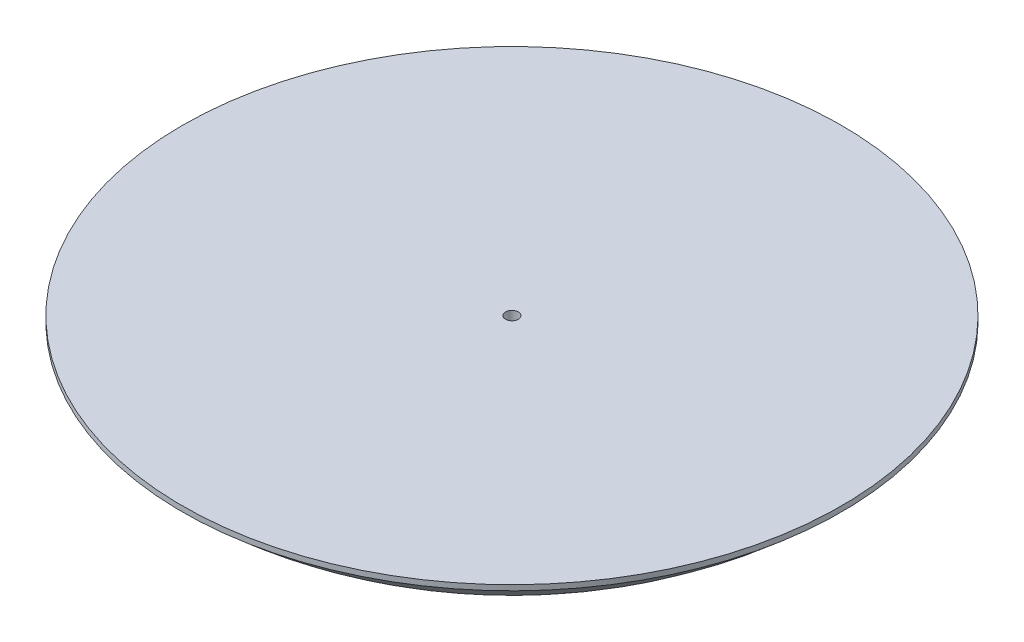
ISO-10303-21;
HEADER;
FILE_DESCRIPTION(('STEP AP214'),'2;1');
FILE_NAME('part.step','',(''),(''),'','','');
FILE_SCHEMA(('AUTOMOTIVE_DESIGN { 1 0 10303 214 1 1 1 1 }'));
ENDSEC;
DATA;
#1=APPLICATION_CONTEXT('core data for automotive mechanical design processes');
#2=APPLICATION_PROTOCOL_DEFINITION('international standard','automotive_design',2000,#1);
#3=PRODUCT_CONTEXT('',#1,'mechanical');
#4=PRODUCT('Part','Part','',(#3));
#5=PRODUCT_RELATED_PRODUCT_CATEGORY('part','',(#4));
#6=PRODUCT_DEFINITION_FORMATION('','',#4);
#7=PRODUCT_DEFINITION_CONTEXT('part definition',#1,'design');
#8=PRODUCT_DEFINITION('design','',#6,#7);
#9=PRODUCT_DEFINITION_SHAPE('','',#8);
#10=(LENGTH_UNIT() NAMED_UNIT(*) SI_UNIT(.MILLI.,.METRE.));
#11=(NAMED_UNIT(*) PLANE_ANGLE_UNIT() SI_UNIT($,.RADIAN.));
#12=(NAMED_UNIT(*) SI_UNIT($,.STERADIAN.) SOLID_ANGLE_UNIT());
#13=UNCERTAINTY_MEASURE_WITH_UNIT(LENGTH_MEASURE(1.E-05),#10,'distance_accuracy_value','');
#14=(GEOMETRIC_REPRESENTATION_CONTEXT(3) GLOBAL_UNCERTAINTY_ASSIGNED_CONTEXT((#13)) GLOBAL_UNIT_ASSIGNED_CONTEXT((#10,
#11,#12)) REPRESENTATION_CONTEXT('',''));
#15=CARTESIAN_POINT('',(0.,0.,0.));
#16=DIRECTION('',(0.,0.,1.));
#17=DIRECTION('',(1.,0.,0.));
#18=AXIS2_PLACEMENT_3D('',#15,#16,#17);
#19=CARTESIAN_POINT('',(-3.9441919782307E-11,-3.09840247534297E-12,0.));
#20=CARTESIAN_POINT('',(3.75000000458887,0.29476152606908,0.));
#21=CARTESIAN_POINT('',(7.4999999988391,5.04827134298948,0.));
#22=CARTESIAN_POINT('',(11.2500000017006,6.10210110981788,0.));
#23=CARTESIAN_POINT('',(14.9999999992605,9.43366962848143,0.));
#24=CARTESIAN_POINT('',(18.7499999992923,11.703227442977,0.));
#25=CARTESIAN_POINT('',(22.4999999993699,13.9531262219356,0.));
#26=CARTESIAN_POINT('',(26.2499999994982,16.1812211283658,0.));
#27=CARTESIAN_POINT('',(29.9999999998415,18.3169684070294,0.));
#28=B_SPLINE_CURVE_WITH_KNOTS('',8,(#19,#20,#21,#22,#23,#24,#25,#26,#27),.UNSPECIFIED.,.F.,.F.,
(9,9),(0.0791303829234686,0.916284581415392),.UNSPECIFIED.);
#29=CARTESIAN_POINT('',(0.,35.1595557269358,0.));
#30=DIRECTION('',(0.,1.,0.));
#31=AXIS1_PLACEMENT('',#29,#30);
#32=SURFACE_OF_REVOLUTION('',#28,#31);
#33=CARTESIAN_POINT('',(0.,0.267238646765137,0.));
#34=DIRECTION('',(0.,1.,0.));
#35=DIRECTION('',(-1.,0.,0.));
#36=AXIS2_PLACEMENT_3D('',#33,#34,#35);
#37=CIRCLE('',#36,1.2);
#38=CARTESIAN_POINT('',(-1.2,0.267238646765137,0.));
#39=VERTEX_POINT('',#38);
#40=EDGE_CURVE('E57',#39,#39,#37,.T.);
#41=ORIENTED_EDGE('',*,*,#40,.T.);
#42=EDGE_LOOP('',(#41));
#43=FACE_BOUND('',#42,.T.);
#44=CARTESIAN_POINT('',(0.,18.3169684071197,0.));
#45=DIRECTION('',(0.,1.,0.));
#46=DIRECTION('',(-1.,0.,0.));
#47=AXIS2_PLACEMENT_3D('',#44,#45,#46);
#48=CIRCLE('',#47,30.);
#49=CARTESIAN_POINT('',(-30.,18.3169684071197,0.));
#50=VERTEX_POINT('',#49);
#51=EDGE_CURVE('E54',#50,#50,#48,.T.);
#52=ORIENTED_EDGE('',*,*,#51,.F.);
#53=EDGE_LOOP('',(#52));
#54=FACE_BOUND('',#53,.T.);
#55=ADVANCED_FACE('F31',(#43,#54),#32,.T.);
#56=CARTESIAN_POINT('',(0.,35.1595557269358,0.));
#57=DIRECTION('',(0.,1.,0.));
#58=DIRECTION('',(-1.,0.,0.));
#59=AXIS2_PLACEMENT_3D('',#56,#57,#58);
#60=CYLINDRICAL_SURFACE('',#59,1.2);
#61=CARTESIAN_POINT('',(0.,35.1595557269358,0.));
#62=DIRECTION('',(0.,1.,0.));
#63=DIRECTION('',(-1.,0.,0.));
#64=AXIS2_PLACEMENT_3D('',#61,#62,#63);
#65=CIRCLE('',#64,1.2);
#66=CARTESIAN_POINT('',(-1.2,35.1595557269358,0.));
#67=VERTEX_POINT('',#66);
#68=EDGE_CURVE('E10',#67,#67,#65,.T.);
#69=ORIENTED_EDGE('',*,*,#68,.T.);
#70=EDGE_LOOP('',(#69));
#71=FACE_BOUND('',#70,.T.);
#72=ORIENTED_EDGE('',*,*,#40,.F.);
#73=EDGE_LOOP('',(#72));
#74=FACE_BOUND('',#73,.T.);
#75=ADVANCED_FACE('F82',(#71,#74),#60,.F.);
#76=CARTESIAN_POINT('',(1.2,35.1595557269358,0.));
#77=DIRECTION('',(0.,-1.,0.));
#78=DIRECTION('',(1.,0.,0.));
#79=AXIS2_PLACEMENT_3D('',#76,#77,#78);
#80=PLANE('',#79);
#81=ORIENTED_EDGE('',*,*,#68,.F.);
#82=EDGE_LOOP('',(#81));
#83=FACE_BOUND('',#82,.T.);
#84=CARTESIAN_POINT('',(0.,35.1595557269358,0.));
#85=DIRECTION('',(0.,1.,0.));
#86=DIRECTION('',(-1.,0.,0.));
#87=AXIS2_PLACEMENT_3D('',#84,#85,#86);
#88=CIRCLE('',#87,62.);
#89=CARTESIAN_POINT('',(-62.,35.1595557269358,0.));
#90=VERTEX_POINT('',#89);
#91=EDGE_CURVE('E38',#90,#90,#88,.T.);
#92=ORIENTED_EDGE('',*,*,#91,.T.);
#93=EDGE_LOOP('',(#92));
#94=FACE_BOUND('',#93,.T.);
#95=ADVANCED_FACE('F79',(#83,#94),#80,.F.);
#96=CARTESIAN_POINT('',(0.,35.1595557269358,0.));
#97=DIRECTION('',(0.,1.,0.));
#98=DIRECTION('',(-1.,0.,0.));
#99=AXIS2_PLACEMENT_3D('',#96,#97,#98);
#100=CYLINDRICAL_SURFACE('',#99,62.);
#101=ORIENTED_EDGE('',*,*,#91,.F.);
#102=EDGE_LOOP('',(#101));
#103=FACE_BOUND('',#102,.T.);
#104=CARTESIAN_POINT('',(0.,34.1595557269358,0.));
#105=DIRECTION('',(0.,1.,0.));
#106=DIRECTION('',(-1.,0.,0.));
#107=AXIS2_PLACEMENT_3D('',#104,#105,#106);
#108=CIRCLE('',#107,62.);
#109=CARTESIAN_POINT('',(-62.,34.1595557269358,0.));
#110=VERTEX_POINT('',#109);
#111=EDGE_CURVE('E42',#110,#110,#108,.T.);
#112=ORIENTED_EDGE('',*,*,#111,.T.);
#113=EDGE_LOOP('',(#112));
#114=FACE_BOUND('',#113,.T.);
#115=ADVANCED_FACE('F74',(#103,#114),#100,.T.);
#116=CARTESIAN_POINT('',(31.9999999999998,19.3169684071196,0.));
#117=CARTESIAN_POINT('',(46.9999999999956,20.4960144808466,0.));
#118=CARTESIAN_POINT('',(61.9999999999979,34.1595557269339,0.));
#119=B_SPLINE_CURVE_WITH_KNOTS('',2,(#116,#117,#118),.UNSPECIFIED.,.F.,.F.,(3,3),
(0.0845474704880553,0.930022175368585),.UNSPECIFIED.);
#120=CARTESIAN_POINT('',(0.,35.1595557269358,0.));
#121=DIRECTION('',(0.,1.,0.));
#122=AXIS1_PLACEMENT('',#120,#121);
#123=SURFACE_OF_REVOLUTION('',#119,#122);
#124=ORIENTED_EDGE('',*,*,#111,.F.);
#125=EDGE_LOOP('',(#124));
#126=FACE_BOUND('',#125,.T.);
#127=CARTESIAN_POINT('',(0.,19.3169684071196,0.));
#128=DIRECTION('',(0.,1.,0.));
#129=DIRECTION('',(-1.,0.,0.));
#130=AXIS2_PLACEMENT_3D('',#127,#128,#129);
#131=CIRCLE('',#130,31.9999999999998);
#132=CARTESIAN_POINT('',(-31.9999999999998,19.3169684071196,0.));
#133=VERTEX_POINT('',#132);
#134=EDGE_CURVE('E46',#133,#133,#131,.T.);
#135=ORIENTED_EDGE('',*,*,#134,.T.);
#136=EDGE_LOOP('',(#135));
#137=FACE_BOUND('',#136,.T.);
#138=ADVANCED_FACE('F69',(#126,#137),#123,.T.);
#139=CARTESIAN_POINT('',(30.,19.3169684071197,0.));
#140=DIRECTION('',(0.,1.,0.));
#141=DIRECTION('',(-1.,0.,0.));
#142=AXIS2_PLACEMENT_3D('',#139,#140,#141);
#143=PLANE('',#142);
#144=ORIENTED_EDGE('',*,*,#134,.F.);
#145=EDGE_LOOP('',(#144));
#146=FACE_BOUND('',#145,.T.);
#147=CARTESIAN_POINT('',(0.,19.3169684071197,0.));
#148=DIRECTION('',(0.,1.,0.));
#149=DIRECTION('',(-1.,0.,0.));
#150=AXIS2_PLACEMENT_3D('',#147,#148,#149);
#151=CIRCLE('',#150,30.);
#152=CARTESIAN_POINT('',(-30.,19.3169684071197,0.));
#153=VERTEX_POINT('',#152);
#154=EDGE_CURVE('E51',#153,#153,#151,.T.);
#155=ORIENTED_EDGE('',*,*,#154,.T.);
#156=EDGE_LOOP('',(#155));
#157=FACE_BOUND('',#156,.T.);
#158=ADVANCED_FACE('F73',(#146,#157),#143,.F.);
#159=CARTESIAN_POINT('',(0.,35.1595557269358,0.));
#160=DIRECTION('',(0.,1.,0.));
#161=DIRECTION('',(-1.,0.,0.));
#162=AXIS2_PLACEMENT_3D('',#159,#160,#161);
#163=CYLINDRICAL_SURFACE('',#162,30.);
#164=ORIENTED_EDGE('',*,*,#154,.F.);
#165=EDGE_LOOP('',(#164));
#166=FACE_BOUND('',#165,.T.);
#167=ORIENTED_EDGE('',*,*,#51,.T.);
#168=EDGE_LOOP('',(#167));
#169=FACE_BOUND('',#168,.T.);
#170=ADVANCED_FACE('F95',(#166,#169),#163,.T.);
#171=CLOSED_SHELL('',(#55,#75,#95,#115,#138,#158,#170));
#172=MANIFOLD_SOLID_BREP('B2',#171);
#173=ADVANCED_BREP_SHAPE_REPRESENTATION('',(#18,#172),#14);
#174=SHAPE_DEFINITION_REPRESENTATION(#9,#173);
ENDSEC;
END-ISO-10303-21;
